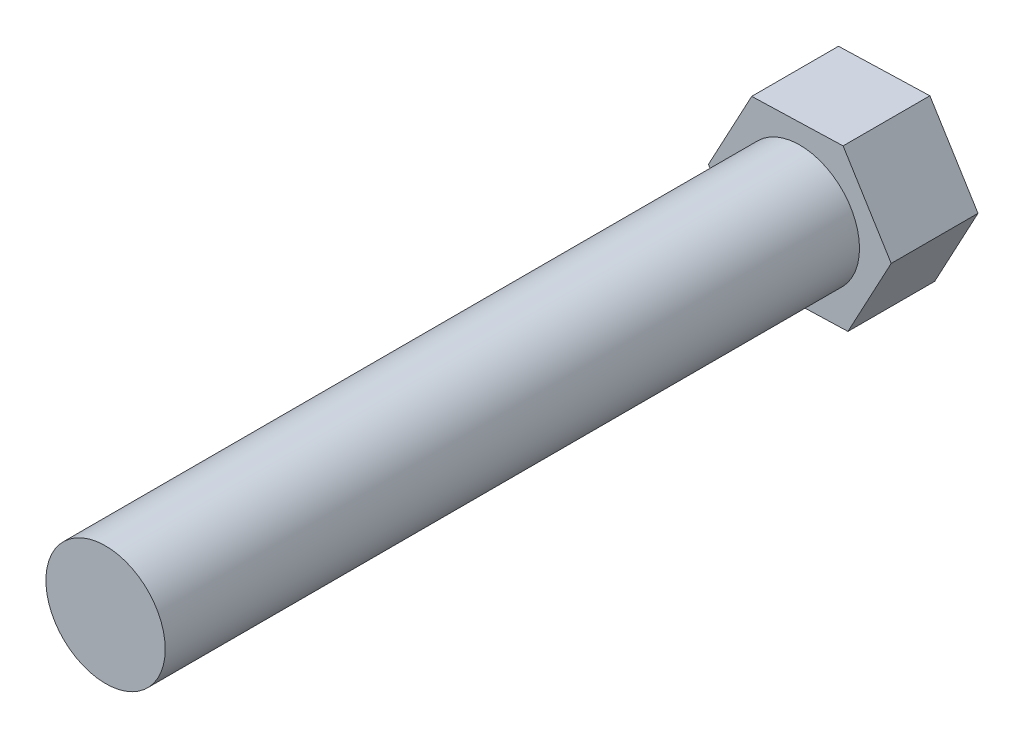
ISO-10303-21;
HEADER;
FILE_DESCRIPTION(('STEP AP214'),'2;1');
FILE_NAME('part.step','',(''),(''),'','','');
FILE_SCHEMA(('AUTOMOTIVE_DESIGN { 1 0 10303 214 1 1 1 1 }'));
ENDSEC;
DATA;
#1=APPLICATION_CONTEXT('core data for automotive mechanical design processes');
#2=APPLICATION_PROTOCOL_DEFINITION('international standard','automotive_design',2000,#1);
#3=PRODUCT_CONTEXT('',#1,'mechanical');
#4=PRODUCT('Part','Part','',(#3));
#5=PRODUCT_RELATED_PRODUCT_CATEGORY('part','',(#4));
#6=PRODUCT_DEFINITION_FORMATION('','',#4);
#7=PRODUCT_DEFINITION_CONTEXT('part definition',#1,'design');
#8=PRODUCT_DEFINITION('design','',#6,#7);
#9=PRODUCT_DEFINITION_SHAPE('','',#8);
#10=(LENGTH_UNIT() NAMED_UNIT(*) SI_UNIT(.MILLI.,.METRE.));
#11=(NAMED_UNIT(*) PLANE_ANGLE_UNIT() SI_UNIT($,.RADIAN.));
#12=(NAMED_UNIT(*) SI_UNIT($,.STERADIAN.) SOLID_ANGLE_UNIT());
#13=UNCERTAINTY_MEASURE_WITH_UNIT(LENGTH_MEASURE(1.E-05),#10,'distance_accuracy_value','');
#14=(GEOMETRIC_REPRESENTATION_CONTEXT(3) GLOBAL_UNCERTAINTY_ASSIGNED_CONTEXT((#13)) GLOBAL_UNIT_ASSIGNED_CONTEXT((#10,
#11,#12)) REPRESENTATION_CONTEXT('',''));
#15=CARTESIAN_POINT('',(0.,0.,0.));
#16=DIRECTION('',(0.,0.,1.));
#17=DIRECTION('',(1.,0.,0.));
#18=AXIS2_PLACEMENT_3D('',#15,#16,#17);
#19=CARTESIAN_POINT('',(0.,0.,32.));
#20=DIRECTION('',(0.,0.,-1.));
#21=DIRECTION('',(-1.,0.,0.));
#22=AXIS2_PLACEMENT_3D('',#19,#20,#21);
#23=CYLINDRICAL_SURFACE('',#22,2.75);
#24=CARTESIAN_POINT('',(0.,0.,32.));
#25=DIRECTION('',(0.,0.,1.));
#26=DIRECTION('',(1.,0.,0.));
#27=AXIS2_PLACEMENT_3D('',#24,#25,#26);
#28=CIRCLE('',#27,2.75);
#29=CARTESIAN_POINT('',(2.75,0.,32.));
#30=VERTEX_POINT('',#29);
#31=EDGE_CURVE('E11',#30,#30,#28,.T.);
#32=ORIENTED_EDGE('',*,*,#31,.F.);
#33=EDGE_LOOP('',(#32));
#34=FACE_BOUND('',#33,.T.);
#35=CARTESIAN_POINT('',(0.,0.,0.));
#36=DIRECTION('',(0.,0.,1.));
#37=DIRECTION('',(1.,0.,0.));
#38=AXIS2_PLACEMENT_3D('',#35,#36,#37);
#39=CIRCLE('',#38,2.75);
#40=CARTESIAN_POINT('',(2.75,0.,0.));
#41=VERTEX_POINT('',#40);
#42=EDGE_CURVE('E46',#41,#41,#39,.T.);
#43=ORIENTED_EDGE('',*,*,#42,.T.);
#44=EDGE_LOOP('',(#43));
#45=FACE_BOUND('',#44,.T.);
#46=ADVANCED_FACE('F43',(#34,#45),#23,.T.);
#47=CARTESIAN_POINT('',(0.,0.,32.));
#48=DIRECTION('',(0.,0.,1.));
#49=DIRECTION('',(1.,0.,0.));
#50=AXIS2_PLACEMENT_3D('',#47,#48,#49);
#51=PLANE('',#50);
#52=ORIENTED_EDGE('',*,*,#31,.T.);
#53=EDGE_LOOP('',(#52));
#54=FACE_BOUND('',#53,.T.);
#55=ADVANCED_FACE('F187',(#54),#51,.T.);
#56=CARTESIAN_POINT('',(2.21778342903196,-3.58316549152794,-4.));
#57=DIRECTION('',(-0.0306299518467951,0.999530792947302,0.));
#58=DIRECTION('',(-0.999530792947302,-0.0306299518467951,0.));
#59=AXIS2_PLACEMENT_3D('',#56,#57,#58);
#60=PLANE('',#59);
#61=DIRECTION('',(-0.999530792947302,-0.0306299518467951,0.));
#62=VECTOR('',#61,1.);
#63=CARTESIAN_POINT('',(2.21778342903196,-3.58316549152794,0.));
#64=LINE('',#63,#62);
#65=CARTESIAN_POINT('',(2.21778342903196,-3.58316549152794,0.));
#66=VERTEX_POINT('',#65);
#67=CARTESIAN_POINT('',(-1.99422062711097,-3.71223953539781,0.));
#68=VERTEX_POINT('',#67);
#69=EDGE_CURVE('E133',#66,#68,#64,.T.);
#70=ORIENTED_EDGE('',*,*,#69,.T.);
#71=DIRECTION('',(0.,0.,1.));
#72=VECTOR('',#71,1.);
#73=CARTESIAN_POINT('',(-1.99422062711097,-3.71223953539781,-4.));
#74=LINE('',#73,#72);
#75=CARTESIAN_POINT('',(-1.99422062711097,-3.71223953539781,-4.));
#76=VERTEX_POINT('',#75);
#77=EDGE_CURVE('E160',#76,#68,#74,.T.);
#78=ORIENTED_EDGE('',*,*,#77,.F.);
#79=DIRECTION('',(-0.999530792947302,-0.0306299518467951,0.));
#80=VECTOR('',#79,1.);
#81=CARTESIAN_POINT('',(2.21778342903196,-3.58316549152794,-4.));
#82=LINE('',#81,#80);
#83=CARTESIAN_POINT('',(2.21778342903196,-3.58316549152794,-4.));
#84=VERTEX_POINT('',#83);
#85=EDGE_CURVE('E149',#84,#76,#82,.T.);
#86=ORIENTED_EDGE('',*,*,#85,.F.);
#87=DIRECTION('',(0.,0.,1.));
#88=VECTOR('',#87,1.);
#89=CARTESIAN_POINT('',(2.21778342903196,-3.58316549152794,-4.));
#90=LINE('',#89,#88);
#91=EDGE_CURVE('E129',#84,#66,#90,.T.);
#92=ORIENTED_EDGE('',*,*,#91,.T.);
#93=EDGE_LOOP('',(#70,#78,#86,#92));
#94=FACE_BOUND('',#93,.T.);
#95=ADVANCED_FACE('F175',(#94),#60,.F.);
#96=CARTESIAN_POINT('',(-1.99422062711097,-3.71223953539781,-4.));
#97=DIRECTION('',(0.85030408263377,0.52629171288967,0.));
#98=DIRECTION('',(-0.52629171288967,0.85030408263377,0.));
#99=AXIS2_PLACEMENT_3D('',#96,#97,#98);
#100=PLANE('',#99);
#101=DIRECTION('',(-0.52629171288967,0.85030408263377,0.));
#102=VECTOR('',#101,1.);
#103=CARTESIAN_POINT('',(-1.99422062711097,-3.71223953539781,0.));
#104=LINE('',#103,#102);
#105=CARTESIAN_POINT('',(-4.21200405614293,-0.129074043869868,0.));
#106=VERTEX_POINT('',#105);
#107=EDGE_CURVE('E137',#68,#106,#104,.T.);
#108=ORIENTED_EDGE('',*,*,#107,.T.);
#109=DIRECTION('',(0.,0.,1.));
#110=VECTOR('',#109,1.);
#111=CARTESIAN_POINT('',(-4.21200405614293,-0.129074043869868,-4.));
#112=LINE('',#111,#110);
#113=CARTESIAN_POINT('',(-4.21200405614293,-0.129074043869868,-4.));
#114=VERTEX_POINT('',#113);
#115=EDGE_CURVE('E156',#114,#106,#112,.T.);
#116=ORIENTED_EDGE('',*,*,#115,.F.);
#117=DIRECTION('',(-0.52629171288967,0.85030408263377,0.));
#118=VECTOR('',#117,1.);
#119=CARTESIAN_POINT('',(-1.99422062711097,-3.71223953539781,-4.));
#120=LINE('',#119,#118);
#121=EDGE_CURVE('E98',#76,#114,#120,.T.);
#122=ORIENTED_EDGE('',*,*,#121,.F.);
#123=ORIENTED_EDGE('',*,*,#77,.T.);
#124=EDGE_LOOP('',(#108,#116,#122,#123));
#125=FACE_BOUND('',#124,.T.);
#126=ADVANCED_FACE('F197',(#125),#100,.F.);
#127=CARTESIAN_POINT('',(-4.21200405614293,-0.129074043869868,-4.));
#128=DIRECTION('',(0.880934034480566,-0.473239080057632,0.));
#129=DIRECTION('',(0.473239080057632,0.880934034480565,0.));
#130=AXIS2_PLACEMENT_3D('',#127,#128,#129);
#131=PLANE('',#130);
#132=DIRECTION('',(0.473239080057632,0.880934034480565,0.));
#133=VECTOR('',#132,1.);
#134=CARTESIAN_POINT('',(-4.21200405614293,-0.129074043869868,0.));
#135=LINE('',#134,#133);
#136=CARTESIAN_POINT('',(-2.21778342903196,3.58316549152794,0.));
#137=VERTEX_POINT('',#136);
#138=EDGE_CURVE('E140',#106,#137,#135,.T.);
#139=ORIENTED_EDGE('',*,*,#138,.T.);
#140=DIRECTION('',(0.,0.,1.));
#141=VECTOR('',#140,1.);
#142=CARTESIAN_POINT('',(-2.21778342903196,3.58316549152794,-4.));
#143=LINE('',#142,#141);
#144=CARTESIAN_POINT('',(-2.21778342903196,3.58316549152794,-4.));
#145=VERTEX_POINT('',#144);
#146=EDGE_CURVE('E122',#145,#137,#143,.T.);
#147=ORIENTED_EDGE('',*,*,#146,.F.);
#148=DIRECTION('',(0.473239080057632,0.880934034480565,0.));
#149=VECTOR('',#148,1.);
#150=CARTESIAN_POINT('',(-4.21200405614293,-0.129074043869868,-4.));
#151=LINE('',#150,#149);
#152=EDGE_CURVE('E111',#114,#145,#151,.T.);
#153=ORIENTED_EDGE('',*,*,#152,.F.);
#154=ORIENTED_EDGE('',*,*,#115,.T.);
#155=EDGE_LOOP('',(#139,#147,#153,#154));
#156=FACE_BOUND('',#155,.T.);
#157=ADVANCED_FACE('F202',(#156),#131,.F.);
#158=CARTESIAN_POINT('',(-2.21778342903196,3.58316549152794,-4.));
#159=DIRECTION('',(0.0306299518467966,-0.999530792947302,0.));
#160=DIRECTION('',(0.999530792947302,0.0306299518467966,0.));
#161=AXIS2_PLACEMENT_3D('',#158,#159,#160);
#162=PLANE('',#161);
#163=DIRECTION('',(0.999530792947302,0.0306299518467966,0.));
#164=VECTOR('',#163,1.);
#165=CARTESIAN_POINT('',(-2.21778342903196,3.58316549152794,0.));
#166=LINE('',#165,#164);
#167=CARTESIAN_POINT('',(1.99422062711097,3.71223953539781,0.));
#168=VERTEX_POINT('',#167);
#169=EDGE_CURVE('E120',#137,#168,#166,.T.);
#170=ORIENTED_EDGE('',*,*,#169,.T.);
#171=DIRECTION('',(0.,0.,1.));
#172=VECTOR('',#171,1.);
#173=CARTESIAN_POINT('',(1.99422062711097,3.71223953539781,-4.));
#174=LINE('',#173,#172);
#175=CARTESIAN_POINT('',(1.99422062711097,3.71223953539781,-4.));
#176=VERTEX_POINT('',#175);
#177=EDGE_CURVE('E117',#176,#168,#174,.T.);
#178=ORIENTED_EDGE('',*,*,#177,.F.);
#179=DIRECTION('',(0.999530792947302,0.0306299518467966,0.));
#180=VECTOR('',#179,1.);
#181=CARTESIAN_POINT('',(-2.21778342903196,3.58316549152794,-4.));
#182=LINE('',#181,#180);
#183=EDGE_CURVE('E105',#145,#176,#182,.T.);
#184=ORIENTED_EDGE('',*,*,#183,.F.);
#185=ORIENTED_EDGE('',*,*,#146,.T.);
#186=EDGE_LOOP('',(#170,#178,#184,#185));
#187=FACE_BOUND('',#186,.T.);
#188=ADVANCED_FACE('F118',(#187),#162,.F.);
#189=CARTESIAN_POINT('',(1.99422062711097,3.71223953539781,-4.));
#190=DIRECTION('',(-0.85030408263377,-0.52629171288967,0.));
#191=DIRECTION('',(0.52629171288967,-0.85030408263377,0.));
#192=AXIS2_PLACEMENT_3D('',#189,#190,#191);
#193=PLANE('',#192);
#194=DIRECTION('',(0.52629171288967,-0.85030408263377,0.));
#195=VECTOR('',#194,1.);
#196=CARTESIAN_POINT('',(1.99422062711097,3.71223953539781,0.));
#197=LINE('',#196,#195);
#198=CARTESIAN_POINT('',(4.21200405614293,0.129074043869869,0.));
#199=VERTEX_POINT('',#198);
#200=EDGE_CURVE('E83',#168,#199,#197,.T.);
#201=ORIENTED_EDGE('',*,*,#200,.T.);
#202=DIRECTION('',(0.,0.,1.));
#203=VECTOR('',#202,1.);
#204=CARTESIAN_POINT('',(4.21200405614293,0.129074043869869,-4.));
#205=LINE('',#204,#203);
#206=CARTESIAN_POINT('',(4.21200405614293,0.129074043869869,-4.));
#207=VERTEX_POINT('',#206);
#208=EDGE_CURVE('E123',#207,#199,#205,.T.);
#209=ORIENTED_EDGE('',*,*,#208,.F.);
#210=DIRECTION('',(0.52629171288967,-0.85030408263377,0.));
#211=VECTOR('',#210,1.);
#212=CARTESIAN_POINT('',(1.99422062711097,3.71223953539781,-4.));
#213=LINE('',#212,#211);
#214=EDGE_CURVE('E109',#176,#207,#213,.T.);
#215=ORIENTED_EDGE('',*,*,#214,.F.);
#216=ORIENTED_EDGE('',*,*,#177,.T.);
#217=EDGE_LOOP('',(#201,#209,#215,#216));
#218=FACE_BOUND('',#217,.T.);
#219=ADVANCED_FACE('F125',(#218),#193,.F.);
#220=CARTESIAN_POINT('',(4.21200405614293,0.129074043869869,-4.));
#221=DIRECTION('',(-0.880934034480566,0.473239080057632,0.));
#222=DIRECTION('',(-0.473239080057632,-0.880934034480566,0.));
#223=AXIS2_PLACEMENT_3D('',#220,#221,#222);
#224=PLANE('',#223);
#225=DIRECTION('',(-0.473239080057632,-0.880934034480565,0.));
#226=VECTOR('',#225,1.);
#227=CARTESIAN_POINT('',(4.21200405614293,0.129074043869869,0.));
#228=LINE('',#227,#226);
#229=EDGE_CURVE('E89',#199,#66,#228,.T.);
#230=ORIENTED_EDGE('',*,*,#229,.T.);
#231=ORIENTED_EDGE('',*,*,#91,.F.);
#232=DIRECTION('',(-0.473239080057632,-0.880934034480565,0.));
#233=VECTOR('',#232,1.);
#234=CARTESIAN_POINT('',(4.21200405614293,0.129074043869869,-4.));
#235=LINE('',#234,#233);
#236=EDGE_CURVE('E60',#207,#84,#235,.T.);
#237=ORIENTED_EDGE('',*,*,#236,.F.);
#238=ORIENTED_EDGE('',*,*,#208,.T.);
#239=EDGE_LOOP('',(#230,#231,#237,#238));
#240=FACE_BOUND('',#239,.T.);
#241=ADVANCED_FACE('F177',(#240),#224,.F.);
#242=CARTESIAN_POINT('',(0.,0.,-4.));
#243=DIRECTION('',(0.,0.,-1.));
#244=DIRECTION('',(-1.,0.,0.));
#245=AXIS2_PLACEMENT_3D('',#242,#243,#244);
#246=PLANE('',#245);
#247=ORIENTED_EDGE('',*,*,#85,.T.);
#248=ORIENTED_EDGE('',*,*,#121,.T.);
#249=ORIENTED_EDGE('',*,*,#152,.T.);
#250=ORIENTED_EDGE('',*,*,#183,.T.);
#251=ORIENTED_EDGE('',*,*,#214,.T.);
#252=ORIENTED_EDGE('',*,*,#236,.T.);
#253=EDGE_LOOP('',(#247,#248,#249,#250,#251,#252));
#254=FACE_BOUND('',#253,.T.);
#255=ADVANCED_FACE('F107',(#254),#246,.T.);
#256=CARTESIAN_POINT('',(0.,0.,0.));
#257=DIRECTION('',(0.,0.,-1.));
#258=DIRECTION('',(-1.,0.,0.));
#259=AXIS2_PLACEMENT_3D('',#256,#257,#258);
#260=PLANE('',#259);
#261=ORIENTED_EDGE('',*,*,#42,.F.);
#262=EDGE_LOOP('',(#261));
#263=FACE_BOUND('',#262,.T.);
#264=ORIENTED_EDGE('',*,*,#69,.F.);
#265=ORIENTED_EDGE('',*,*,#229,.F.);
#266=ORIENTED_EDGE('',*,*,#200,.F.);
#267=ORIENTED_EDGE('',*,*,#169,.F.);
#268=ORIENTED_EDGE('',*,*,#138,.F.);
#269=ORIENTED_EDGE('',*,*,#107,.F.);
#270=EDGE_LOOP('',(#264,#265,#266,#267,#268,#269));
#271=FACE_BOUND('',#270,.T.);
#272=ADVANCED_FACE('F168',(#263,#271),#260,.F.);
#273=CLOSED_SHELL('',(#46,#55,#95,#126,#157,#188,#219,#241,#255,#272));
#274=MANIFOLD_SOLID_BREP('B2',#273);
#275=ADVANCED_BREP_SHAPE_REPRESENTATION('',(#18,#274),#14);
#276=SHAPE_DEFINITION_REPRESENTATION(#9,#275);
ENDSEC;
END-ISO-10303-21;
